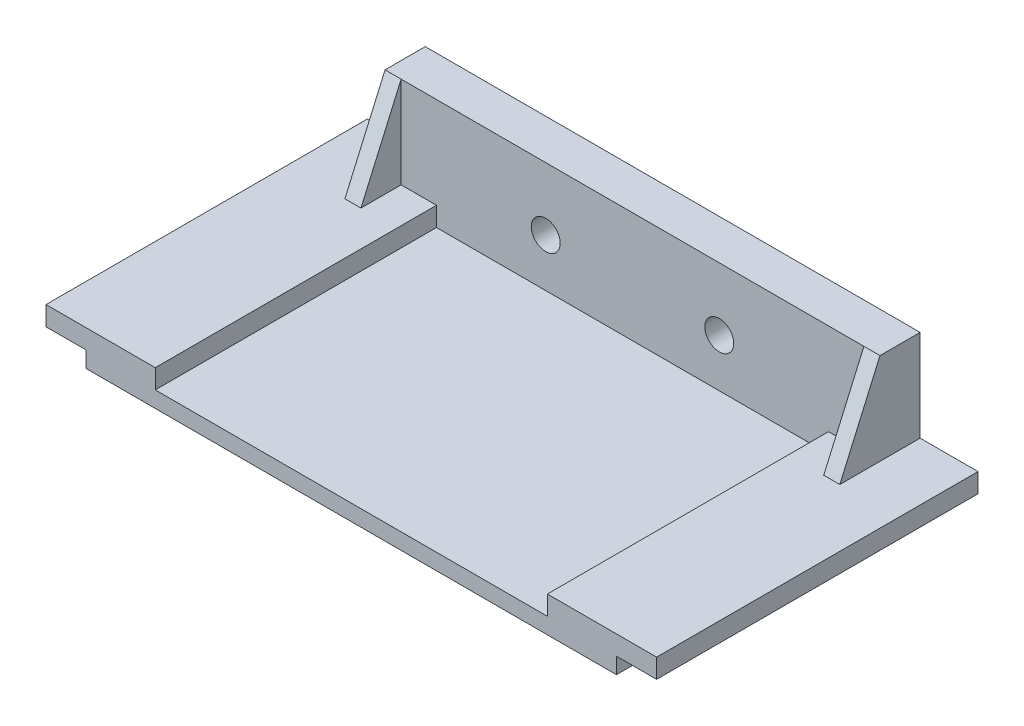
ISO-10303-21;
HEADER;
FILE_DESCRIPTION(('STEP AP214'),'2;1');
FILE_NAME('part.step','',(''),(''),'','','');
FILE_SCHEMA(('AUTOMOTIVE_DESIGN { 1 0 10303 214 1 1 1 1 }'));
ENDSEC;
DATA;
#1=APPLICATION_CONTEXT('core data for automotive mechanical design processes');
#2=APPLICATION_PROTOCOL_DEFINITION('international standard','automotive_design',2000,#1);
#3=PRODUCT_CONTEXT('',#1,'mechanical');
#4=PRODUCT('Part','Part','',(#3));
#5=PRODUCT_RELATED_PRODUCT_CATEGORY('part','',(#4));
#6=PRODUCT_DEFINITION_FORMATION('','',#4);
#7=PRODUCT_DEFINITION_CONTEXT('part definition',#1,'design');
#8=PRODUCT_DEFINITION('design','',#6,#7);
#9=PRODUCT_DEFINITION_SHAPE('','',#8);
#10=(LENGTH_UNIT() NAMED_UNIT(*) SI_UNIT(.MILLI.,.METRE.));
#11=(NAMED_UNIT(*) PLANE_ANGLE_UNIT() SI_UNIT($,.RADIAN.));
#12=(NAMED_UNIT(*) SI_UNIT($,.STERADIAN.) SOLID_ANGLE_UNIT());
#13=UNCERTAINTY_MEASURE_WITH_UNIT(LENGTH_MEASURE(1.E-05),#10,'distance_accuracy_value','');
#14=(GEOMETRIC_REPRESENTATION_CONTEXT(3) GLOBAL_UNCERTAINTY_ASSIGNED_CONTEXT((#13)) GLOBAL_UNIT_ASSIGNED_CONTEXT((#10,
#11,#12)) REPRESENTATION_CONTEXT('',''));
#15=CARTESIAN_POINT('',(0.,0.,0.));
#16=DIRECTION('',(0.,0.,1.));
#17=DIRECTION('',(1.,0.,0.));
#18=AXIS2_PLACEMENT_3D('',#15,#16,#17);
#19=CARTESIAN_POINT('',(-41.91,2.54,-25.4));
#20=DIRECTION('',(1.,0.,0.));
#21=DIRECTION('',(0.,0.,-1.));
#22=AXIS2_PLACEMENT_3D('',#19,#20,#21);
#23=PLANE('',#22);
#24=DIRECTION('',(0.,0.,1.));
#25=VECTOR('',#24,1.);
#26=CARTESIAN_POINT('',(-41.91,2.54,-25.4));
#27=LINE('',#26,#25);
#28=CARTESIAN_POINT('',(-41.91,2.54,-25.3999999999996));
#29=VERTEX_POINT('',#28);
#30=CARTESIAN_POINT('',(-41.91,2.54,25.4));
#31=VERTEX_POINT('',#30);
#32=EDGE_CURVE('E175',#29,#31,#27,.T.);
#33=ORIENTED_EDGE('',*,*,#32,.F.);
#34=DIRECTION('',(0.,-1.,0.));
#35=VECTOR('',#34,1.);
#36=CARTESIAN_POINT('',(-41.91,2.54,-25.4));
#37=LINE('',#36,#35);
#38=CARTESIAN_POINT('',(-41.91,0.,-25.4));
#39=VERTEX_POINT('',#38);
#40=EDGE_CURVE('E184',#29,#39,#37,.T.);
#41=ORIENTED_EDGE('',*,*,#40,.T.);
#42=DIRECTION('',(0.,0.,1.));
#43=VECTOR('',#42,1.);
#44=CARTESIAN_POINT('',(-41.91,0.,-25.4));
#45=LINE('',#44,#43);
#46=CARTESIAN_POINT('',(-41.91,0.,25.4));
#47=VERTEX_POINT('',#46);
#48=EDGE_CURVE('E176',#39,#47,#45,.T.);
#49=ORIENTED_EDGE('',*,*,#48,.T.);
#50=DIRECTION('',(0.,-1.,0.));
#51=VECTOR('',#50,1.);
#52=CARTESIAN_POINT('',(-41.91,2.54,25.4));
#53=LINE('',#52,#51);
#54=EDGE_CURVE('E271',#31,#47,#53,.T.);
#55=ORIENTED_EDGE('',*,*,#54,.F.);
#56=EDGE_LOOP('',(#33,#41,#49,#55));
#57=FACE_BOUND('',#56,.T.);
#58=ADVANCED_FACE('F32',(#57),#23,.F.);
#59=CARTESIAN_POINT('',(41.91,2.54,-25.4));
#60=DIRECTION('',(-1.,0.,0.));
#61=DIRECTION('',(0.,0.,1.));
#62=AXIS2_PLACEMENT_3D('',#59,#60,#61);
#63=PLANE('',#62);
#64=DIRECTION('',(0.,-1.,0.));
#65=VECTOR('',#64,1.);
#66=CARTESIAN_POINT('',(41.91,2.54,-25.4));
#67=LINE('',#66,#65);
#68=CARTESIAN_POINT('',(41.91,2.54,-25.3999999999996));
#69=VERTEX_POINT('',#68);
#70=CARTESIAN_POINT('',(41.91,0.,-25.4));
#71=VERTEX_POINT('',#70);
#72=EDGE_CURVE('E272',#69,#71,#67,.T.);
#73=ORIENTED_EDGE('',*,*,#72,.F.);
#74=DIRECTION('',(0.,0.,-1.));
#75=VECTOR('',#74,1.);
#76=CARTESIAN_POINT('',(41.91,2.54,-25.4));
#77=LINE('',#76,#75);
#78=CARTESIAN_POINT('',(41.91,2.54,25.4));
#79=VERTEX_POINT('',#78);
#80=EDGE_CURVE('E266',#79,#69,#77,.T.);
#81=ORIENTED_EDGE('',*,*,#80,.F.);
#82=DIRECTION('',(0.,-1.,0.));
#83=VECTOR('',#82,1.);
#84=CARTESIAN_POINT('',(41.91,2.54,25.4));
#85=LINE('',#84,#83);
#86=CARTESIAN_POINT('',(41.91,0.,25.4));
#87=VERTEX_POINT('',#86);
#88=EDGE_CURVE('E268',#79,#87,#85,.T.);
#89=ORIENTED_EDGE('',*,*,#88,.T.);
#90=DIRECTION('',(0.,0.,-1.));
#91=VECTOR('',#90,1.);
#92=CARTESIAN_POINT('',(41.91,0.,-25.4));
#93=LINE('',#92,#91);
#94=EDGE_CURVE('E263',#87,#71,#93,.T.);
#95=ORIENTED_EDGE('',*,*,#94,.T.);
#96=EDGE_LOOP('',(#73,#81,#89,#95));
#97=FACE_BOUND('',#96,.T.);
#98=ADVANCED_FACE('F349',(#97),#63,.F.);
#99=CARTESIAN_POINT('',(0.,5.588,0.));
#100=DIRECTION('',(0.,-1.,0.));
#101=DIRECTION('',(0.,0.,-1.));
#102=AXIS2_PLACEMENT_3D('',#99,#100,#101);
#103=PLANE('',#102);
#104=DIRECTION('',(0.,0.,-1.));
#105=VECTOR('',#104,1.);
#106=CARTESIAN_POINT('',(48.26,5.588,25.4));
#107=LINE('',#106,#105);
#108=CARTESIAN_POINT('',(48.26,5.588,25.4));
#109=VERTEX_POINT('',#108);
#110=CARTESIAN_POINT('',(48.26,5.588,-25.3999999999996));
#111=VERTEX_POINT('',#110);
#112=EDGE_CURVE('E302',#109,#111,#107,.T.);
#113=ORIENTED_EDGE('',*,*,#112,.T.);
#114=DIRECTION('',(-1.,0.,0.));
#115=VECTOR('',#114,1.);
#116=CARTESIAN_POINT('',(-48.26,5.588,-25.4));
#117=LINE('',#116,#115);
#118=CARTESIAN_POINT('',(39.116,5.588,-25.4));
#119=VERTEX_POINT('',#118);
#120=EDGE_CURVE('E307',#111,#119,#117,.T.);
#121=ORIENTED_EDGE('',*,*,#120,.T.);
#122=DIRECTION('',(0.,0.,-1.));
#123=VECTOR('',#122,1.);
#124=CARTESIAN_POINT('',(39.116,5.588,0.));
#125=LINE('',#124,#123);
#126=CARTESIAN_POINT('',(39.116,5.588,-12.7));
#127=VERTEX_POINT('',#126);
#128=EDGE_CURVE('E41',#127,#119,#125,.T.);
#129=ORIENTED_EDGE('',*,*,#128,.F.);
#130=DIRECTION('',(1.,0.,0.));
#131=VECTOR('',#130,1.);
#132=CARTESIAN_POINT('',(36.576,5.588,-12.7));
#133=LINE('',#132,#131);
#134=CARTESIAN_POINT('',(36.576,5.588,-12.7));
#135=VERTEX_POINT('',#134);
#136=EDGE_CURVE('E210',#135,#127,#133,.T.);
#137=ORIENTED_EDGE('',*,*,#136,.F.);
#138=DIRECTION('',(0.,0.,-1.));
#139=VECTOR('',#138,1.);
#140=CARTESIAN_POINT('',(36.576,5.588,-12.7));
#141=LINE('',#140,#139);
#142=CARTESIAN_POINT('',(36.576,5.588,-19.05));
#143=VERTEX_POINT('',#142);
#144=EDGE_CURVE('E198',#135,#143,#141,.T.);
#145=ORIENTED_EDGE('',*,*,#144,.T.);
#146=DIRECTION('',(1.,0.,0.));
#147=VECTOR('',#146,1.);
#148=CARTESIAN_POINT('',(0.,5.588,-19.05));
#149=LINE('',#148,#147);
#150=CARTESIAN_POINT('',(30.988,5.588,-19.05));
#151=VERTEX_POINT('',#150);
#152=EDGE_CURVE('E254',#151,#143,#149,.T.);
#153=ORIENTED_EDGE('',*,*,#152,.F.);
#154=DIRECTION('',(0.,0.,-1.));
#155=VECTOR('',#154,1.);
#156=CARTESIAN_POINT('',(30.988,5.588,0.));
#157=LINE('',#156,#155);
#158=CARTESIAN_POINT('',(30.988,5.588,25.4));
#159=VERTEX_POINT('',#158);
#160=EDGE_CURVE('E274',#159,#151,#157,.T.);
#161=ORIENTED_EDGE('',*,*,#160,.F.);
#162=DIRECTION('',(1.,0.,0.));
#163=VECTOR('',#162,1.);
#164=CARTESIAN_POINT('',(-48.26,5.588,25.4));
#165=LINE('',#164,#163);
#166=EDGE_CURVE('E310',#159,#109,#165,.T.);
#167=ORIENTED_EDGE('',*,*,#166,.T.);
#168=EDGE_LOOP('',(#113,#121,#129,#137,#145,#153,#161,#167));
#169=FACE_BOUND('',#168,.T.);
#170=ADVANCED_FACE('F355',(#169),#103,.F.);
#171=CARTESIAN_POINT('',(-39.116,20.066,-19.05));
#172=DIRECTION('',(0.,0.,-1.));
#173=DIRECTION('',(-1.,0.,0.));
#174=AXIS2_PLACEMENT_3D('',#171,#172,#173);
#175=PLANE('',#174);
#176=CARTESIAN_POINT('',(13.716,10.16,-19.05));
#177=DIRECTION('',(0.,0.,-1.));
#178=DIRECTION('',(-1.,0.,0.));
#179=AXIS2_PLACEMENT_3D('',#176,#177,#178);
#180=CIRCLE('',#179,2.286);
#181=CARTESIAN_POINT('',(11.43,10.16,-19.05));
#182=VERTEX_POINT('',#181);
#183=EDGE_CURVE('E232',#182,#182,#180,.T.);
#184=ORIENTED_EDGE('',*,*,#183,.T.);
#185=EDGE_LOOP('',(#184));
#186=FACE_BOUND('',#185,.T.);
#187=CARTESIAN_POINT('',(-13.716,10.16,-19.05));
#188=DIRECTION('',(0.,0.,-1.));
#189=DIRECTION('',(-1.,0.,0.));
#190=AXIS2_PLACEMENT_3D('',#187,#188,#189);
#191=CIRCLE('',#190,2.286);
#192=CARTESIAN_POINT('',(-16.002,10.16,-19.05));
#193=VERTEX_POINT('',#192);
#194=EDGE_CURVE('E36',#193,#193,#191,.T.);
#195=ORIENTED_EDGE('',*,*,#194,.T.);
#196=EDGE_LOOP('',(#195));
#197=FACE_BOUND('',#196,.T.);
#198=DIRECTION('',(0.,1.,0.));
#199=VECTOR('',#198,1.);
#200=CARTESIAN_POINT('',(36.576,5.588,-19.05));
#201=LINE('',#200,#199);
#202=CARTESIAN_POINT('',(36.576,20.066,-19.05));
#203=VERTEX_POINT('',#202);
#204=EDGE_CURVE('E201',#143,#203,#201,.T.);
#205=ORIENTED_EDGE('',*,*,#204,.T.);
#206=DIRECTION('',(1.,0.,0.));
#207=VECTOR('',#206,1.);
#208=CARTESIAN_POINT('',(-39.116,20.066,-19.05));
#209=LINE('',#208,#207);
#210=CARTESIAN_POINT('',(-36.576,20.066,-19.05));
#211=VERTEX_POINT('',#210);
#212=EDGE_CURVE('E243',#211,#203,#209,.T.);
#213=ORIENTED_EDGE('',*,*,#212,.F.);
#214=DIRECTION('',(0.,-1.,0.));
#215=VECTOR('',#214,1.);
#216=CARTESIAN_POINT('',(-36.576,5.588,-19.05));
#217=LINE('',#216,#215);
#218=CARTESIAN_POINT('',(-36.576,5.588,-19.05));
#219=VERTEX_POINT('',#218);
#220=EDGE_CURVE('E216',#211,#219,#217,.T.);
#221=ORIENTED_EDGE('',*,*,#220,.T.);
#222=DIRECTION('',(1.,0.,0.));
#223=VECTOR('',#222,1.);
#224=CARTESIAN_POINT('',(0.,5.588,-19.05));
#225=LINE('',#224,#223);
#226=CARTESIAN_POINT('',(-30.988,5.588,-19.05));
#227=VERTEX_POINT('',#226);
#228=EDGE_CURVE('E258',#219,#227,#225,.T.);
#229=ORIENTED_EDGE('',*,*,#228,.T.);
#230=DIRECTION('',(0.,1.,0.));
#231=VECTOR('',#230,1.);
#232=CARTESIAN_POINT('',(-30.988,2.54,-19.05));
#233=LINE('',#232,#231);
#234=CARTESIAN_POINT('',(-30.988,2.54,-19.05));
#235=VERTEX_POINT('',#234);
#236=EDGE_CURVE('E57',#235,#227,#233,.T.);
#237=ORIENTED_EDGE('',*,*,#236,.F.);
#238=DIRECTION('',(-1.,0.,0.));
#239=VECTOR('',#238,1.);
#240=CARTESIAN_POINT('',(0.,2.54,-19.05));
#241=LINE('',#240,#239);
#242=CARTESIAN_POINT('',(30.988,2.54,-19.05));
#243=VERTEX_POINT('',#242);
#244=EDGE_CURVE('E322',#243,#235,#241,.T.);
#245=ORIENTED_EDGE('',*,*,#244,.F.);
#246=DIRECTION('',(0.,1.,0.));
#247=VECTOR('',#246,1.);
#248=CARTESIAN_POINT('',(30.988,2.54,-19.05));
#249=LINE('',#248,#247);
#250=EDGE_CURVE('E252',#243,#151,#249,.T.);
#251=ORIENTED_EDGE('',*,*,#250,.T.);
#252=ORIENTED_EDGE('',*,*,#152,.T.);
#253=EDGE_LOOP('',(#205,#213,#221,#229,#237,#245,#251,#252));
#254=FACE_BOUND('',#253,.T.);
#255=ADVANCED_FACE('F331',(#186,#197,#254),#175,.F.);
#256=CARTESIAN_POINT('',(-39.116,5.588,-25.4));
#257=VERTEX_POINT('',#256);
#258=CARTESIAN_POINT('',(-48.26,5.588,-25.3999999999996));
#259=VERTEX_POINT('',#258);
#260=EDGE_CURVE('E305',#257,#259,#117,.T.);
#261=ORIENTED_EDGE('',*,*,#260,.T.);
#262=DIRECTION('',(0.,0.,1.));
#263=VECTOR('',#262,1.);
#264=CARTESIAN_POINT('',(-48.26,5.588,25.4));
#265=LINE('',#264,#263);
#266=CARTESIAN_POINT('',(-48.26,5.588,25.4));
#267=VERTEX_POINT('',#266);
#268=EDGE_CURVE('E189',#259,#267,#265,.T.);
#269=ORIENTED_EDGE('',*,*,#268,.T.);
#270=CARTESIAN_POINT('',(-30.988,5.588,25.4));
#271=VERTEX_POINT('',#270);
#272=EDGE_CURVE('E311',#267,#271,#165,.T.);
#273=ORIENTED_EDGE('',*,*,#272,.T.);
#274=DIRECTION('',(0.,0.,-1.));
#275=VECTOR('',#274,1.);
#276=CARTESIAN_POINT('',(-30.988,5.588,0.));
#277=LINE('',#276,#275);
#278=EDGE_CURVE('E286',#271,#227,#277,.T.);
#279=ORIENTED_EDGE('',*,*,#278,.T.);
#280=ORIENTED_EDGE('',*,*,#228,.F.);
#281=DIRECTION('',(0.,0.,1.));
#282=VECTOR('',#281,1.);
#283=CARTESIAN_POINT('',(-36.576,5.588,-19.05));
#284=LINE('',#283,#282);
#285=CARTESIAN_POINT('',(-36.576,5.588,-12.7));
#286=VERTEX_POINT('',#285);
#287=EDGE_CURVE('E219',#219,#286,#284,.T.);
#288=ORIENTED_EDGE('',*,*,#287,.T.);
#289=DIRECTION('',(-1.,0.,0.));
#290=VECTOR('',#289,1.);
#291=CARTESIAN_POINT('',(-36.576,5.588,-12.7));
#292=LINE('',#291,#290);
#293=CARTESIAN_POINT('',(-39.116,5.588,-12.7));
#294=VERTEX_POINT('',#293);
#295=EDGE_CURVE('E223',#286,#294,#292,.T.);
#296=ORIENTED_EDGE('',*,*,#295,.T.);
#297=DIRECTION('',(0.,0.,1.));
#298=VECTOR('',#297,1.);
#299=CARTESIAN_POINT('',(-39.116,5.588,0.));
#300=LINE('',#299,#298);
#301=EDGE_CURVE('E11',#257,#294,#300,.T.);
#302=ORIENTED_EDGE('',*,*,#301,.F.);
#303=EDGE_LOOP('',(#261,#269,#273,#279,#280,#288,#296,#302));
#304=FACE_BOUND('',#303,.T.);
#305=ADVANCED_FACE('F368',(#304),#103,.F.);
#306=CARTESIAN_POINT('',(-30.988,2.54,0.));
#307=DIRECTION('',(1.,0.,0.));
#308=DIRECTION('',(0.,0.,-1.));
#309=AXIS2_PLACEMENT_3D('',#306,#307,#308);
#310=PLANE('',#309);
#311=DIRECTION('',(0.,0.,-1.));
#312=VECTOR('',#311,1.);
#313=CARTESIAN_POINT('',(-30.988,2.54,0.));
#314=LINE('',#313,#312);
#315=CARTESIAN_POINT('',(-30.988,2.54,25.4));
#316=VERTEX_POINT('',#315);
#317=EDGE_CURVE('E289',#316,#235,#314,.T.);
#318=ORIENTED_EDGE('',*,*,#317,.T.);
#319=ORIENTED_EDGE('',*,*,#236,.T.);
#320=ORIENTED_EDGE('',*,*,#278,.F.);
#321=DIRECTION('',(0.,1.,0.));
#322=VECTOR('',#321,1.);
#323=CARTESIAN_POINT('',(-30.988,2.54,25.4));
#324=LINE('',#323,#322);
#325=EDGE_CURVE('E297',#316,#271,#324,.T.);
#326=ORIENTED_EDGE('',*,*,#325,.F.);
#327=EDGE_LOOP('',(#318,#319,#320,#326));
#328=FACE_BOUND('',#327,.T.);
#329=ADVANCED_FACE('F365',(#328),#310,.T.);
#330=CARTESIAN_POINT('',(30.988,2.54,0.));
#331=DIRECTION('',(1.,0.,0.));
#332=DIRECTION('',(0.,0.,-1.));
#333=AXIS2_PLACEMENT_3D('',#330,#331,#332);
#334=PLANE('',#333);
#335=ORIENTED_EDGE('',*,*,#250,.F.);
#336=DIRECTION('',(0.,0.,-1.));
#337=VECTOR('',#336,1.);
#338=CARTESIAN_POINT('',(30.988,2.54,0.));
#339=LINE('',#338,#337);
#340=CARTESIAN_POINT('',(30.988,2.54,25.4));
#341=VERTEX_POINT('',#340);
#342=EDGE_CURVE('E285',#341,#243,#339,.T.);
#343=ORIENTED_EDGE('',*,*,#342,.F.);
#344=DIRECTION('',(0.,1.,0.));
#345=VECTOR('',#344,1.);
#346=CARTESIAN_POINT('',(30.988,2.54,25.4));
#347=LINE('',#346,#345);
#348=EDGE_CURVE('E292',#341,#159,#347,.T.);
#349=ORIENTED_EDGE('',*,*,#348,.T.);
#350=ORIENTED_EDGE('',*,*,#160,.T.);
#351=EDGE_LOOP('',(#335,#343,#349,#350));
#352=FACE_BOUND('',#351,.T.);
#353=ADVANCED_FACE('F363',(#352),#334,.F.);
#354=CARTESIAN_POINT('',(0.,2.54,0.));
#355=DIRECTION('',(0.,1.,0.));
#356=DIRECTION('',(0.,0.,1.));
#357=AXIS2_PLACEMENT_3D('',#354,#355,#356);
#358=PLANE('',#357);
#359=ORIENTED_EDGE('',*,*,#342,.T.);
#360=ORIENTED_EDGE('',*,*,#244,.T.);
#361=ORIENTED_EDGE('',*,*,#317,.F.);
#362=DIRECTION('',(1.,0.,0.));
#363=VECTOR('',#362,1.);
#364=CARTESIAN_POINT('',(0.,2.54,25.4));
#365=LINE('',#364,#363);
#366=EDGE_CURVE('E282',#316,#341,#365,.T.);
#367=ORIENTED_EDGE('',*,*,#366,.T.);
#368=EDGE_LOOP('',(#359,#360,#361,#367));
#369=FACE_BOUND('',#368,.T.);
#370=ADVANCED_FACE('F360',(#369),#358,.T.);
#371=CARTESIAN_POINT('',(48.26,5.588,25.4));
#372=DIRECTION('',(-1.,0.,0.));
#373=DIRECTION('',(0.,0.,1.));
#374=AXIS2_PLACEMENT_3D('',#371,#372,#373);
#375=PLANE('',#374);
#376=DIRECTION('',(0.,0.,1.));
#377=VECTOR('',#376,1.);
#378=CARTESIAN_POINT('',(48.26,2.54,-25.4));
#379=LINE('',#378,#377);
#380=CARTESIAN_POINT('',(48.26,2.54,-25.3999999999996));
#381=VERTEX_POINT('',#380);
#382=CARTESIAN_POINT('',(48.26,2.54,25.4));
#383=VERTEX_POINT('',#382);
#384=EDGE_CURVE('E260',#381,#383,#379,.T.);
#385=ORIENTED_EDGE('',*,*,#384,.F.);
#386=DIRECTION('',(0.,1.,0.));
#387=VECTOR('',#386,1.);
#388=CARTESIAN_POINT('',(48.26,5.588,-25.3999999999996));
#389=LINE('',#388,#387);
#390=EDGE_CURVE('E194',#381,#111,#389,.T.);
#391=ORIENTED_EDGE('',*,*,#390,.T.);
#392=ORIENTED_EDGE('',*,*,#112,.F.);
#393=DIRECTION('',(0.,-1.,0.));
#394=VECTOR('',#393,1.);
#395=CARTESIAN_POINT('',(48.26,5.588,25.4));
#396=LINE('',#395,#394);
#397=EDGE_CURVE('E314',#109,#383,#396,.T.);
#398=ORIENTED_EDGE('',*,*,#397,.T.);
#399=EDGE_LOOP('',(#385,#391,#392,#398));
#400=FACE_BOUND('',#399,.T.);
#401=ADVANCED_FACE('F34',(#400),#375,.F.);
#402=CARTESIAN_POINT('',(-48.26,5.588,-25.4));
#403=DIRECTION('',(0.,0.,1.));
#404=DIRECTION('',(1.,0.,0.));
#405=AXIS2_PLACEMENT_3D('',#402,#403,#404);
#406=PLANE('',#405);
#407=CARTESIAN_POINT('',(-13.716,10.16,-25.4));
#408=DIRECTION('',(0.,0.,-1.));
#409=DIRECTION('',(-1.,0.,0.));
#410=AXIS2_PLACEMENT_3D('',#407,#408,#409);
#411=CIRCLE('',#410,2.286);
#412=CARTESIAN_POINT('',(-16.002,10.16,-25.4));
#413=VERTEX_POINT('',#412);
#414=EDGE_CURVE('E229',#413,#413,#411,.T.);
#415=ORIENTED_EDGE('',*,*,#414,.F.);
#416=EDGE_LOOP('',(#415));
#417=FACE_BOUND('',#416,.T.);
#418=CARTESIAN_POINT('',(13.716,10.16,-25.4));
#419=DIRECTION('',(0.,0.,-1.));
#420=DIRECTION('',(-1.,0.,0.));
#421=AXIS2_PLACEMENT_3D('',#418,#419,#420);
#422=CIRCLE('',#421,2.286);
#423=CARTESIAN_POINT('',(11.43,10.16,-25.4));
#424=VERTEX_POINT('',#423);
#425=EDGE_CURVE('E228',#424,#424,#422,.T.);
#426=ORIENTED_EDGE('',*,*,#425,.F.);
#427=EDGE_LOOP('',(#426));
#428=FACE_BOUND('',#427,.T.);
#429=ORIENTED_EDGE('',*,*,#120,.F.);
#430=ORIENTED_EDGE('',*,*,#390,.F.);
#431=DIRECTION('',(1.,0.,0.));
#432=VECTOR('',#431,1.);
#433=CARTESIAN_POINT('',(48.26,2.54,-25.3999999999996));
#434=LINE('',#433,#432);
#435=EDGE_CURVE('E185',#69,#381,#434,.T.);
#436=ORIENTED_EDGE('',*,*,#435,.F.);
#437=ORIENTED_EDGE('',*,*,#72,.T.);
#438=DIRECTION('',(-1.,0.,0.));
#439=VECTOR('',#438,1.);
#440=CARTESIAN_POINT('',(-48.26,0.,-25.4));
#441=LINE('',#440,#439);
#442=EDGE_CURVE('E300',#71,#39,#441,.T.);
#443=ORIENTED_EDGE('',*,*,#442,.T.);
#444=ORIENTED_EDGE('',*,*,#40,.F.);
#445=DIRECTION('',(1.,0.,0.));
#446=VECTOR('',#445,1.);
#447=CARTESIAN_POINT('',(-41.91,2.54,-25.3999999999996));
#448=LINE('',#447,#446);
#449=CARTESIAN_POINT('',(-48.26,2.54,-25.3999999999996));
#450=VERTEX_POINT('',#449);
#451=EDGE_CURVE('E167',#450,#29,#448,.T.);
#452=ORIENTED_EDGE('',*,*,#451,.F.);
#453=DIRECTION('',(0.,-1.,0.));
#454=VECTOR('',#453,1.);
#455=CARTESIAN_POINT('',(-48.26,2.54,-25.3999999999996));
#456=LINE('',#455,#454);
#457=EDGE_CURVE('E182',#259,#450,#456,.T.);
#458=ORIENTED_EDGE('',*,*,#457,.F.);
#459=ORIENTED_EDGE('',*,*,#260,.F.);
#460=DIRECTION('',(0.,-1.,0.));
#461=VECTOR('',#460,1.);
#462=CARTESIAN_POINT('',(-39.116,20.066,-25.4));
#463=LINE('',#462,#461);
#464=CARTESIAN_POINT('',(-39.116,20.066,-25.4));
#465=VERTEX_POINT('',#464);
#466=EDGE_CURVE('E247',#465,#257,#463,.T.);
#467=ORIENTED_EDGE('',*,*,#466,.F.);
#468=DIRECTION('',(-1.,0.,0.));
#469=VECTOR('',#468,1.);
#470=CARTESIAN_POINT('',(-39.116,20.066,-25.4));
#471=LINE('',#470,#469);
#472=CARTESIAN_POINT('',(39.116,20.066,-25.4));
#473=VERTEX_POINT('',#472);
#474=EDGE_CURVE('E238',#473,#465,#471,.T.);
#475=ORIENTED_EDGE('',*,*,#474,.F.);
#476=DIRECTION('',(0.,-1.,0.));
#477=VECTOR('',#476,1.);
#478=CARTESIAN_POINT('',(39.116,20.066,-25.4));
#479=LINE('',#478,#477);
#480=EDGE_CURVE('E249',#473,#119,#479,.T.);
#481=ORIENTED_EDGE('',*,*,#480,.T.);
#482=EDGE_LOOP('',(#429,#430,#436,#437,#443,#444,#452,#458,#459,#467,#475,#481));
#483=FACE_BOUND('',#482,.T.);
#484=ADVANCED_FACE('F180',(#417,#428,#483),#406,.F.);
#485=CARTESIAN_POINT('',(-48.26,5.588,25.4));
#486=DIRECTION('',(0.,0.,-1.));
#487=DIRECTION('',(-1.,0.,0.));
#488=AXIS2_PLACEMENT_3D('',#485,#486,#487);
#489=PLANE('',#488);
#490=DIRECTION('',(1.,0.,0.));
#491=VECTOR('',#490,1.);
#492=CARTESIAN_POINT('',(-48.26,0.,25.4));
#493=LINE('',#492,#491);
#494=EDGE_CURVE('E306',#47,#87,#493,.T.);
#495=ORIENTED_EDGE('',*,*,#494,.T.);
#496=ORIENTED_EDGE('',*,*,#88,.F.);
#497=DIRECTION('',(-1.,0.,0.));
#498=VECTOR('',#497,1.);
#499=CARTESIAN_POINT('',(48.26,2.54,25.4));
#500=LINE('',#499,#498);
#501=EDGE_CURVE('E262',#383,#79,#500,.T.);
#502=ORIENTED_EDGE('',*,*,#501,.F.);
#503=ORIENTED_EDGE('',*,*,#397,.F.);
#504=ORIENTED_EDGE('',*,*,#166,.F.);
#505=ORIENTED_EDGE('',*,*,#348,.F.);
#506=ORIENTED_EDGE('',*,*,#366,.F.);
#507=ORIENTED_EDGE('',*,*,#325,.T.);
#508=ORIENTED_EDGE('',*,*,#272,.F.);
#509=DIRECTION('',(0.,-1.,0.));
#510=VECTOR('',#509,1.);
#511=CARTESIAN_POINT('',(-48.26,5.588,25.4));
#512=LINE('',#511,#510);
#513=CARTESIAN_POINT('',(-48.26,2.54,25.4));
#514=VERTEX_POINT('',#513);
#515=EDGE_CURVE('E320',#267,#514,#512,.T.);
#516=ORIENTED_EDGE('',*,*,#515,.T.);
#517=DIRECTION('',(-1.,0.,0.));
#518=VECTOR('',#517,1.);
#519=CARTESIAN_POINT('',(-48.26,2.54,25.4));
#520=LINE('',#519,#518);
#521=EDGE_CURVE('E170',#31,#514,#520,.T.);
#522=ORIENTED_EDGE('',*,*,#521,.F.);
#523=ORIENTED_EDGE('',*,*,#54,.T.);
#524=EDGE_LOOP('',(#495,#496,#502,#503,#504,#505,#506,#507,#508,#516,#522,#523));
#525=FACE_BOUND('',#524,.T.);
#526=ADVANCED_FACE('F380',(#525),#489,.F.);
#527=CARTESIAN_POINT('',(-48.26,5.588,25.4));
#528=DIRECTION('',(1.,0.,0.));
#529=DIRECTION('',(0.,0.,-1.));
#530=AXIS2_PLACEMENT_3D('',#527,#528,#529);
#531=PLANE('',#530);
#532=ORIENTED_EDGE('',*,*,#268,.F.);
#533=ORIENTED_EDGE('',*,*,#457,.T.);
#534=DIRECTION('',(0.,0.,-1.));
#535=VECTOR('',#534,1.);
#536=CARTESIAN_POINT('',(-48.26,2.54,-25.4));
#537=LINE('',#536,#535);
#538=EDGE_CURVE('E164',#514,#450,#537,.T.);
#539=ORIENTED_EDGE('',*,*,#538,.F.);
#540=ORIENTED_EDGE('',*,*,#515,.F.);
#541=EDGE_LOOP('',(#532,#533,#539,#540));
#542=FACE_BOUND('',#541,.T.);
#543=ADVANCED_FACE('F188',(#542),#531,.F.);
#544=CARTESIAN_POINT('',(0.,0.,0.));
#545=DIRECTION('',(0.,-1.,0.));
#546=DIRECTION('',(0.,0.,-1.));
#547=AXIS2_PLACEMENT_3D('',#544,#545,#546);
#548=PLANE('',#547);
#549=ORIENTED_EDGE('',*,*,#94,.F.);
#550=ORIENTED_EDGE('',*,*,#494,.F.);
#551=ORIENTED_EDGE('',*,*,#48,.F.);
#552=ORIENTED_EDGE('',*,*,#442,.F.);
#553=EDGE_LOOP('',(#549,#550,#551,#552));
#554=FACE_BOUND('',#553,.T.);
#555=ADVANCED_FACE('F376',(#554),#548,.T.);
#556=CARTESIAN_POINT('',(0.,2.54,0.));
#557=DIRECTION('',(0.,1.,0.));
#558=DIRECTION('',(0.,0.,1.));
#559=AXIS2_PLACEMENT_3D('',#556,#557,#558);
#560=PLANE('',#559);
#561=ORIENTED_EDGE('',*,*,#538,.T.);
#562=ORIENTED_EDGE('',*,*,#451,.T.);
#563=ORIENTED_EDGE('',*,*,#32,.T.);
#564=ORIENTED_EDGE('',*,*,#521,.T.);
#565=EDGE_LOOP('',(#561,#562,#563,#564));
#566=FACE_BOUND('',#565,.T.);
#567=ADVANCED_FACE('F166',(#566),#560,.F.);
#568=CARTESIAN_POINT('',(0.,2.54,0.));
#569=DIRECTION('',(0.,-1.,0.));
#570=DIRECTION('',(0.,0.,-1.));
#571=AXIS2_PLACEMENT_3D('',#568,#569,#570);
#572=PLANE('',#571);
#573=ORIENTED_EDGE('',*,*,#80,.T.);
#574=ORIENTED_EDGE('',*,*,#435,.T.);
#575=ORIENTED_EDGE('',*,*,#384,.T.);
#576=ORIENTED_EDGE('',*,*,#501,.T.);
#577=EDGE_LOOP('',(#573,#574,#575,#576));
#578=FACE_BOUND('',#577,.T.);
#579=ADVANCED_FACE('F404',(#578),#572,.T.);
#580=CARTESIAN_POINT('',(-39.116,20.066,-19.05));
#581=DIRECTION('',(1.,0.,0.));
#582=DIRECTION('',(0.,0.,-1.));
#583=AXIS2_PLACEMENT_3D('',#580,#581,#582);
#584=PLANE('',#583);
#585=ORIENTED_EDGE('',*,*,#466,.T.);
#586=ORIENTED_EDGE('',*,*,#301,.T.);
#587=DIRECTION('',(0.,0.915788208793949,-0.401661495085065));
#588=VECTOR('',#587,1.);
#589=CARTESIAN_POINT('',(-39.116,5.588,-12.7));
#590=LINE('',#589,#588);
#591=CARTESIAN_POINT('',(-39.116,20.066,-19.05));
#592=VERTEX_POINT('',#591);
#593=EDGE_CURVE('E213',#294,#592,#590,.T.);
#594=ORIENTED_EDGE('',*,*,#593,.T.);
#595=DIRECTION('',(0.,0.,1.));
#596=VECTOR('',#595,1.);
#597=CARTESIAN_POINT('',(-39.116,20.066,-19.05));
#598=LINE('',#597,#596);
#599=EDGE_CURVE('E240',#465,#592,#598,.T.);
#600=ORIENTED_EDGE('',*,*,#599,.F.);
#601=EDGE_LOOP('',(#585,#586,#594,#600));
#602=FACE_BOUND('',#601,.T.);
#603=ADVANCED_FACE('F418',(#602),#584,.F.);
#604=CARTESIAN_POINT('',(39.116,20.066,-19.05));
#605=DIRECTION('',(-1.,0.,0.));
#606=DIRECTION('',(0.,0.,1.));
#607=AXIS2_PLACEMENT_3D('',#604,#605,#606);
#608=PLANE('',#607);
#609=DIRECTION('',(0.,0.,-1.));
#610=VECTOR('',#609,1.);
#611=CARTESIAN_POINT('',(39.116,20.066,-19.05));
#612=LINE('',#611,#610);
#613=CARTESIAN_POINT('',(39.116,20.066,-19.05));
#614=VERTEX_POINT('',#613);
#615=EDGE_CURVE('E235',#614,#473,#612,.T.);
#616=ORIENTED_EDGE('',*,*,#615,.F.);
#617=DIRECTION('',(0.,-0.915788208793949,0.401661495085065));
#618=VECTOR('',#617,1.);
#619=CARTESIAN_POINT('',(39.116,20.066,-19.05));
#620=LINE('',#619,#618);
#621=EDGE_CURVE('E197',#614,#127,#620,.T.);
#622=ORIENTED_EDGE('',*,*,#621,.T.);
#623=ORIENTED_EDGE('',*,*,#128,.T.);
#624=ORIENTED_EDGE('',*,*,#480,.F.);
#625=EDGE_LOOP('',(#616,#622,#623,#624));
#626=FACE_BOUND('',#625,.T.);
#627=ADVANCED_FACE('F425',(#626),#608,.F.);
#628=CARTESIAN_POINT('',(0.,20.066,0.));
#629=DIRECTION('',(0.,-1.,0.));
#630=DIRECTION('',(0.,0.,-1.));
#631=AXIS2_PLACEMENT_3D('',#628,#629,#630);
#632=PLANE('',#631);
#633=ORIENTED_EDGE('',*,*,#615,.T.);
#634=ORIENTED_EDGE('',*,*,#474,.T.);
#635=ORIENTED_EDGE('',*,*,#599,.T.);
#636=EDGE_CURVE('E244',#592,#211,#209,.T.);
#637=ORIENTED_EDGE('',*,*,#636,.T.);
#638=ORIENTED_EDGE('',*,*,#212,.T.);
#639=DIRECTION('',(1.,0.,0.));
#640=VECTOR('',#639,1.);
#641=CARTESIAN_POINT('',(36.576,20.066,-19.05));
#642=LINE('',#641,#640);
#643=EDGE_CURVE('E207',#203,#614,#642,.T.);
#644=ORIENTED_EDGE('',*,*,#643,.T.);
#645=EDGE_LOOP('',(#633,#634,#635,#637,#638,#644));
#646=FACE_BOUND('',#645,.T.);
#647=ADVANCED_FACE('F345',(#646),#632,.F.);
#648=CARTESIAN_POINT('',(13.716,10.16,25.4));
#649=DIRECTION('',(0.,0.,-1.));
#650=DIRECTION('',(-1.,0.,0.));
#651=AXIS2_PLACEMENT_3D('',#648,#649,#650);
#652=CYLINDRICAL_SURFACE('',#651,2.286);
#653=ORIENTED_EDGE('',*,*,#425,.T.);
#654=EDGE_LOOP('',(#653));
#655=FACE_BOUND('',#654,.T.);
#656=ORIENTED_EDGE('',*,*,#183,.F.);
#657=EDGE_LOOP('',(#656));
#658=FACE_BOUND('',#657,.T.);
#659=ADVANCED_FACE('F336',(#655,#658),#652,.F.);
#660=CARTESIAN_POINT('',(-13.716,10.16,25.4));
#661=DIRECTION('',(0.,0.,-1.));
#662=DIRECTION('',(-1.,0.,0.));
#663=AXIS2_PLACEMENT_3D('',#660,#661,#662);
#664=CYLINDRICAL_SURFACE('',#663,2.286);
#665=ORIENTED_EDGE('',*,*,#414,.T.);
#666=EDGE_LOOP('',(#665));
#667=FACE_BOUND('',#666,.T.);
#668=ORIENTED_EDGE('',*,*,#194,.F.);
#669=EDGE_LOOP('',(#668));
#670=FACE_BOUND('',#669,.T.);
#671=ADVANCED_FACE('F333',(#667,#670),#664,.F.);
#672=CARTESIAN_POINT('',(-36.576,5.588,-12.7));
#673=DIRECTION('',(0.,0.401661495085065,0.915788208793949));
#674=DIRECTION('',(0.,-0.915788208793949,0.401661495085065));
#675=AXIS2_PLACEMENT_3D('',#672,#673,#674);
#676=PLANE('',#675);
#677=ORIENTED_EDGE('',*,*,#593,.F.);
#678=ORIENTED_EDGE('',*,*,#295,.F.);
#679=DIRECTION('',(0.,0.915788208793949,-0.401661495085065));
#680=VECTOR('',#679,1.);
#681=CARTESIAN_POINT('',(-36.576,5.588,-12.7));
#682=LINE('',#681,#680);
#683=EDGE_CURVE('E49',#286,#211,#682,.T.);
#684=ORIENTED_EDGE('',*,*,#683,.T.);
#685=ORIENTED_EDGE('',*,*,#636,.F.);
#686=EDGE_LOOP('',(#677,#678,#684,#685));
#687=FACE_BOUND('',#686,.T.);
#688=ADVANCED_FACE('F335',(#687),#676,.T.);
#689=CARTESIAN_POINT('',(-36.576,0.,0.));
#690=DIRECTION('',(1.,0.,0.));
#691=DIRECTION('',(0.,0.,-1.));
#692=AXIS2_PLACEMENT_3D('',#689,#690,#691);
#693=PLANE('',#692);
#694=ORIENTED_EDGE('',*,*,#220,.F.);
#695=ORIENTED_EDGE('',*,*,#683,.F.);
#696=ORIENTED_EDGE('',*,*,#287,.F.);
#697=EDGE_LOOP('',(#694,#695,#696));
#698=FACE_BOUND('',#697,.T.);
#699=ADVANCED_FACE('F343',(#698),#693,.T.);
#700=CARTESIAN_POINT('',(36.576,20.066,-19.05));
#701=DIRECTION('',(0.,0.401661495085065,0.915788208793949));
#702=DIRECTION('',(0.,-0.915788208793949,0.401661495085065));
#703=AXIS2_PLACEMENT_3D('',#700,#701,#702);
#704=PLANE('',#703);
#705=ORIENTED_EDGE('',*,*,#621,.F.);
#706=ORIENTED_EDGE('',*,*,#643,.F.);
#707=DIRECTION('',(0.,-0.915788208793949,0.401661495085065));
#708=VECTOR('',#707,1.);
#709=CARTESIAN_POINT('',(36.576,20.066,-19.05));
#710=LINE('',#709,#708);
#711=EDGE_CURVE('E204',#203,#135,#710,.T.);
#712=ORIENTED_EDGE('',*,*,#711,.T.);
#713=ORIENTED_EDGE('',*,*,#136,.T.);
#714=EDGE_LOOP('',(#705,#706,#712,#713));
#715=FACE_BOUND('',#714,.T.);
#716=ADVANCED_FACE('F429',(#715),#704,.T.);
#717=CARTESIAN_POINT('',(36.576,0.,0.));
#718=DIRECTION('',(1.,0.,0.));
#719=DIRECTION('',(0.,0.,-1.));
#720=AXIS2_PLACEMENT_3D('',#717,#718,#719);
#721=PLANE('',#720);
#722=ORIENTED_EDGE('',*,*,#144,.F.);
#723=ORIENTED_EDGE('',*,*,#711,.F.);
#724=ORIENTED_EDGE('',*,*,#204,.F.);
#725=EDGE_LOOP('',(#722,#723,#724));
#726=FACE_BOUND('',#725,.T.);
#727=ADVANCED_FACE('F432',(#726),#721,.F.);
#728=CLOSED_SHELL('',(#58,#98,#170,#255,#305,#329,#353,#370,#401,#484,#526,#543,#555,#567,#579,
#603,#627,#647,#659,#671,#688,#699,#716,#727));
#729=MANIFOLD_SOLID_BREP('B2',#728);
#730=ADVANCED_BREP_SHAPE_REPRESENTATION('',(#18,#729),#14);
#731=SHAPE_DEFINITION_REPRESENTATION(#9,#730);
ENDSEC;
END-ISO-10303-21;
